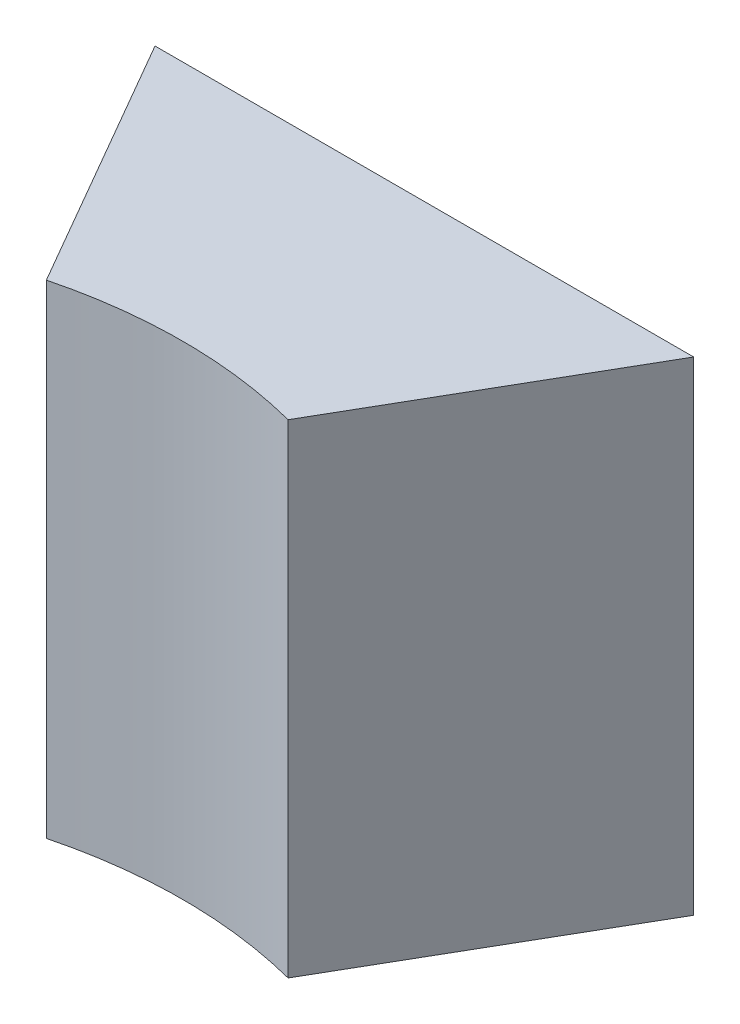
ISO-10303-21;
HEADER;
FILE_DESCRIPTION(('STEP AP214'),'2;1');
FILE_NAME('part.step','',(''),(''),'','','');
FILE_SCHEMA(('AUTOMOTIVE_DESIGN { 1 0 10303 214 1 1 1 1 }'));
ENDSEC;
DATA;
#1=APPLICATION_CONTEXT('core data for automotive mechanical design processes');
#2=APPLICATION_PROTOCOL_DEFINITION('international standard','automotive_design',2000,#1);
#3=PRODUCT_CONTEXT('',#1,'mechanical');
#4=PRODUCT('Part','Part','',(#3));
#5=PRODUCT_RELATED_PRODUCT_CATEGORY('part','',(#4));
#6=PRODUCT_DEFINITION_FORMATION('','',#4);
#7=PRODUCT_DEFINITION_CONTEXT('part definition',#1,'design');
#8=PRODUCT_DEFINITION('design','',#6,#7);
#9=PRODUCT_DEFINITION_SHAPE('','',#8);
#10=(LENGTH_UNIT() NAMED_UNIT(*) SI_UNIT(.MILLI.,.METRE.));
#11=(NAMED_UNIT(*) PLANE_ANGLE_UNIT() SI_UNIT($,.RADIAN.));
#12=(NAMED_UNIT(*) SI_UNIT($,.STERADIAN.) SOLID_ANGLE_UNIT());
#13=UNCERTAINTY_MEASURE_WITH_UNIT(LENGTH_MEASURE(1.E-05),#10,'distance_accuracy_value','');
#14=(GEOMETRIC_REPRESENTATION_CONTEXT(3) GLOBAL_UNCERTAINTY_ASSIGNED_CONTEXT((#13)) GLOBAL_UNIT_ASSIGNED_CONTEXT((#10,
#11,#12)) REPRESENTATION_CONTEXT('',''));
#15=CARTESIAN_POINT('',(0.,0.,0.));
#16=DIRECTION('',(0.,0.,1.));
#17=DIRECTION('',(1.,0.,0.));
#18=AXIS2_PLACEMENT_3D('',#15,#16,#17);
#19=CARTESIAN_POINT('',(55.7008409409492,100.,-150.));
#20=DIRECTION('',(0.,0.,1.));
#21=DIRECTION('',(1.,0.,0.));
#22=AXIS2_PLACEMENT_3D('',#19,#20,#21);
#23=PLANE('',#22);
#24=DIRECTION('',(-1.,0.,0.));
#25=VECTOR('',#24,1.);
#26=CARTESIAN_POINT('',(55.7008409409492,0.,-150.));
#27=LINE('',#26,#25);
#28=CARTESIAN_POINT('',(55.7008409409492,0.,-150.));
#29=VERTEX_POINT('',#28);
#30=CARTESIAN_POINT('',(-55.7008409409492,0.,-150.));
#31=VERTEX_POINT('',#30);
#32=EDGE_CURVE('E96',#29,#31,#27,.T.);
#33=ORIENTED_EDGE('',*,*,#32,.T.);
#34=DIRECTION('',(0.,-1.,0.));
#35=VECTOR('',#34,1.);
#36=CARTESIAN_POINT('',(-55.7008409409492,100.,-150.));
#37=LINE('',#36,#35);
#38=CARTESIAN_POINT('',(-55.7008409409492,100.,-150.));
#39=VERTEX_POINT('',#38);
#40=EDGE_CURVE('E11',#39,#31,#37,.T.);
#41=ORIENTED_EDGE('',*,*,#40,.F.);
#42=DIRECTION('',(-1.,0.,0.));
#43=VECTOR('',#42,1.);
#44=CARTESIAN_POINT('',(55.7008409409492,100.,-150.));
#45=LINE('',#44,#43);
#46=CARTESIAN_POINT('',(55.7008409409492,100.,-150.));
#47=VERTEX_POINT('',#46);
#48=EDGE_CURVE('E84',#47,#39,#45,.T.);
#49=ORIENTED_EDGE('',*,*,#48,.F.);
#50=DIRECTION('',(0.,-1.,0.));
#51=VECTOR('',#50,1.);
#52=CARTESIAN_POINT('',(55.7008409409492,100.,-150.));
#53=LINE('',#52,#51);
#54=EDGE_CURVE('E92',#47,#29,#53,.T.);
#55=ORIENTED_EDGE('',*,*,#54,.T.);
#56=EDGE_LOOP('',(#33,#41,#49,#55));
#57=FACE_BOUND('',#56,.T.);
#58=ADVANCED_FACE('F33',(#57),#23,.F.);
#59=CARTESIAN_POINT('',(-55.7008409409492,100.,-150.));
#60=DIRECTION('',(0.866025403784438,0.,-0.500000000000002));
#61=DIRECTION('',(-0.500000000000002,0.,-0.866025403784438));
#62=AXIS2_PLACEMENT_3D('',#59,#60,#61);
#63=PLANE('',#62);
#64=DIRECTION('',(0.500000000000002,0.,0.866025403784438));
#65=VECTOR('',#64,1.);
#66=CARTESIAN_POINT('',(-55.7008409409492,0.,-150.));
#67=LINE('',#66,#65);
#68=CARTESIAN_POINT('',(-25.,0.,-96.8245836551854));
#69=VERTEX_POINT('',#68);
#70=EDGE_CURVE('E88',#31,#69,#67,.T.);
#71=ORIENTED_EDGE('',*,*,#70,.T.);
#72=DIRECTION('',(0.,-1.,0.));
#73=VECTOR('',#72,1.);
#74=CARTESIAN_POINT('',(-25.,100.,-96.8245836551854));
#75=LINE('',#74,#73);
#76=CARTESIAN_POINT('',(-25.,100.,-96.8245836551854));
#77=VERTEX_POINT('',#76);
#78=EDGE_CURVE('E41',#77,#69,#75,.T.);
#79=ORIENTED_EDGE('',*,*,#78,.F.);
#80=DIRECTION('',(0.500000000000002,0.,0.866025403784438));
#81=VECTOR('',#80,1.);
#82=CARTESIAN_POINT('',(-55.7008409409492,100.,-150.));
#83=LINE('',#82,#81);
#84=EDGE_CURVE('E79',#39,#77,#83,.T.);
#85=ORIENTED_EDGE('',*,*,#84,.F.);
#86=ORIENTED_EDGE('',*,*,#40,.T.);
#87=EDGE_LOOP('',(#71,#79,#85,#86));
#88=FACE_BOUND('',#87,.T.);
#89=ADVANCED_FACE('F87',(#88),#63,.F.);
#90=CARTESIAN_POINT('',(0.,100.,0.));
#91=DIRECTION('',(0.,-1.,0.));
#92=DIRECTION('',(0.,0.,-1.));
#93=AXIS2_PLACEMENT_3D('',#90,#91,#92);
#94=CYLINDRICAL_SURFACE('',#93,100.);
#95=CARTESIAN_POINT('',(0.,0.,0.));
#96=DIRECTION('',(0.,-1.,0.));
#97=DIRECTION('',(0.,0.,1.));
#98=AXIS2_PLACEMENT_3D('',#95,#96,#97);
#99=CIRCLE('',#98,100.);
#100=CARTESIAN_POINT('',(25.,0.,-96.8245836551854));
#101=VERTEX_POINT('',#100);
#102=EDGE_CURVE('E66',#69,#101,#99,.T.);
#103=ORIENTED_EDGE('',*,*,#102,.T.);
#104=DIRECTION('',(0.,-1.,0.));
#105=VECTOR('',#104,1.);
#106=CARTESIAN_POINT('',(25.,100.,-96.8245836551854));
#107=LINE('',#106,#105);
#108=CARTESIAN_POINT('',(25.,100.,-96.8245836551854));
#109=VERTEX_POINT('',#108);
#110=EDGE_CURVE('E89',#109,#101,#107,.T.);
#111=ORIENTED_EDGE('',*,*,#110,.F.);
#112=CARTESIAN_POINT('',(0.,100.,0.));
#113=DIRECTION('',(0.,-1.,0.));
#114=DIRECTION('',(0.,0.,1.));
#115=AXIS2_PLACEMENT_3D('',#112,#113,#114);
#116=CIRCLE('',#115,100.);
#117=EDGE_CURVE('E82',#77,#109,#116,.T.);
#118=ORIENTED_EDGE('',*,*,#117,.F.);
#119=ORIENTED_EDGE('',*,*,#78,.T.);
#120=EDGE_LOOP('',(#103,#111,#118,#119));
#121=FACE_BOUND('',#120,.T.);
#122=ADVANCED_FACE('F90',(#121),#94,.F.);
#123=CARTESIAN_POINT('',(55.7008409409492,100.,-150.));
#124=DIRECTION('',(-0.866025403784438,0.,-0.500000000000002));
#125=DIRECTION('',(-0.500000000000002,0.,0.866025403784438));
#126=AXIS2_PLACEMENT_3D('',#123,#124,#125);
#127=PLANE('',#126);
#128=DIRECTION('',(0.500000000000002,0.,-0.866025403784438));
#129=VECTOR('',#128,1.);
#130=CARTESIAN_POINT('',(55.7008409409492,0.,-150.));
#131=LINE('',#130,#129);
#132=EDGE_CURVE('E72',#101,#29,#131,.T.);
#133=ORIENTED_EDGE('',*,*,#132,.T.);
#134=ORIENTED_EDGE('',*,*,#54,.F.);
#135=DIRECTION('',(0.500000000000002,0.,-0.866025403784438));
#136=VECTOR('',#135,1.);
#137=CARTESIAN_POINT('',(55.7008409409492,100.,-150.));
#138=LINE('',#137,#136);
#139=EDGE_CURVE('E49',#109,#47,#138,.T.);
#140=ORIENTED_EDGE('',*,*,#139,.F.);
#141=ORIENTED_EDGE('',*,*,#110,.T.);
#142=EDGE_LOOP('',(#133,#134,#140,#141));
#143=FACE_BOUND('',#142,.T.);
#144=ADVANCED_FACE('F103',(#143),#127,.F.);
#145=CARTESIAN_POINT('',(0.,100.,0.));
#146=DIRECTION('',(0.,1.,0.));
#147=DIRECTION('',(0.,0.,1.));
#148=AXIS2_PLACEMENT_3D('',#145,#146,#147);
#149=PLANE('',#148);
#150=ORIENTED_EDGE('',*,*,#48,.T.);
#151=ORIENTED_EDGE('',*,*,#84,.T.);
#152=ORIENTED_EDGE('',*,*,#117,.T.);
#153=ORIENTED_EDGE('',*,*,#139,.T.);
#154=EDGE_LOOP('',(#150,#151,#152,#153));
#155=FACE_BOUND('',#154,.T.);
#156=ADVANCED_FACE('F80',(#155),#149,.T.);
#157=CARTESIAN_POINT('',(0.,0.,0.));
#158=DIRECTION('',(0.,1.,0.));
#159=DIRECTION('',(0.,0.,1.));
#160=AXIS2_PLACEMENT_3D('',#157,#158,#159);
#161=PLANE('',#160);
#162=ORIENTED_EDGE('',*,*,#32,.F.);
#163=ORIENTED_EDGE('',*,*,#132,.F.);
#164=ORIENTED_EDGE('',*,*,#102,.F.);
#165=ORIENTED_EDGE('',*,*,#70,.F.);
#166=EDGE_LOOP('',(#162,#163,#164,#165));
#167=FACE_BOUND('',#166,.T.);
#168=ADVANCED_FACE('F106',(#167),#161,.F.);
#169=CLOSED_SHELL('',(#58,#89,#122,#144,#156,#168));
#170=MANIFOLD_SOLID_BREP('B2',#169);
#171=ADVANCED_BREP_SHAPE_REPRESENTATION('',(#18,#170),#14);
#172=SHAPE_DEFINITION_REPRESENTATION(#9,#171);
ENDSEC;
END-ISO-10303-21;
